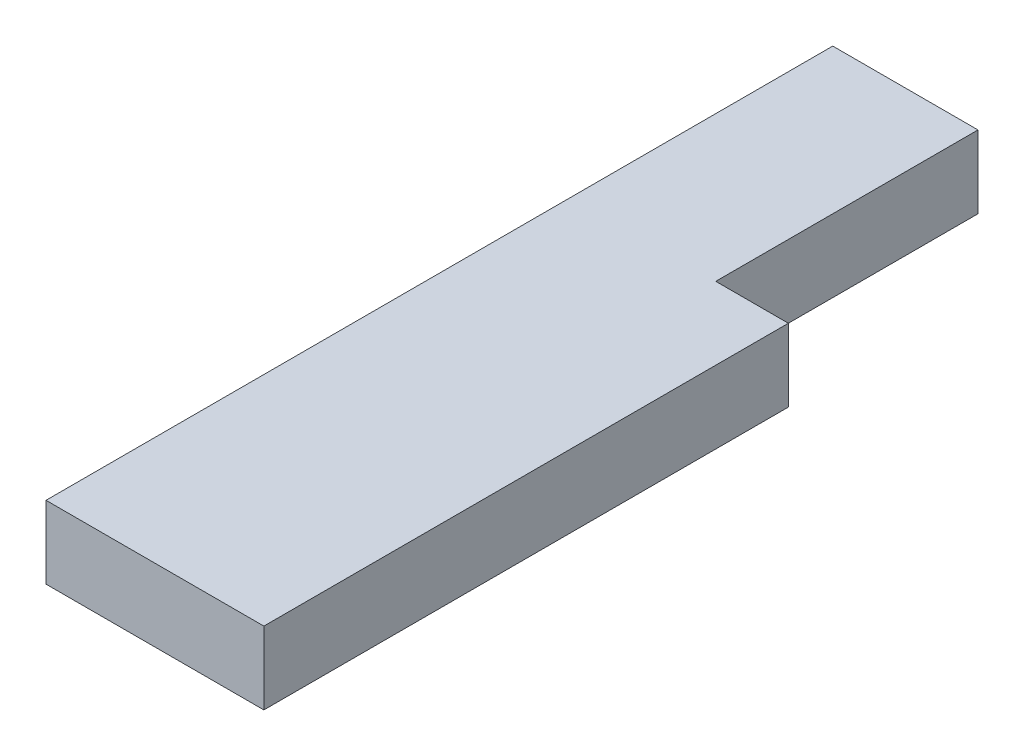
ISO-10303-21;
HEADER;
FILE_DESCRIPTION(('STEP AP214'),'2;1');
FILE_NAME('part.step','',(''),(''),'','','');
FILE_SCHEMA(('AUTOMOTIVE_DESIGN { 1 0 10303 214 1 1 1 1 }'));
ENDSEC;
DATA;
#1=APPLICATION_CONTEXT('core data for automotive mechanical design processes');
#2=APPLICATION_PROTOCOL_DEFINITION('international standard','automotive_design',2000,#1);
#3=PRODUCT_CONTEXT('',#1,'mechanical');
#4=PRODUCT('Part','Part','',(#3));
#5=PRODUCT_RELATED_PRODUCT_CATEGORY('part','',(#4));
#6=PRODUCT_DEFINITION_FORMATION('','',#4);
#7=PRODUCT_DEFINITION_CONTEXT('part definition',#1,'design');
#8=PRODUCT_DEFINITION('design','',#6,#7);
#9=PRODUCT_DEFINITION_SHAPE('','',#8);
#10=(LENGTH_UNIT() NAMED_UNIT(*) SI_UNIT(.MILLI.,.METRE.));
#11=(NAMED_UNIT(*) PLANE_ANGLE_UNIT() SI_UNIT($,.RADIAN.));
#12=(NAMED_UNIT(*) SI_UNIT($,.STERADIAN.) SOLID_ANGLE_UNIT());
#13=UNCERTAINTY_MEASURE_WITH_UNIT(LENGTH_MEASURE(1.E-05),#10,'distance_accuracy_value','');
#14=(GEOMETRIC_REPRESENTATION_CONTEXT(3) GLOBAL_UNCERTAINTY_ASSIGNED_CONTEXT((#13)) GLOBAL_UNIT_ASSIGNED_CONTEXT((#10,
#11,#12)) REPRESENTATION_CONTEXT('',''));
#15=CARTESIAN_POINT('',(0.,0.,0.));
#16=DIRECTION('',(0.,0.,1.));
#17=DIRECTION('',(1.,0.,0.));
#18=AXIS2_PLACEMENT_3D('',#15,#16,#17);
#19=CARTESIAN_POINT('',(-27.,-9.,130.));
#20=DIRECTION('',(-1.,0.,0.));
#21=DIRECTION('',(0.,0.,1.));
#22=AXIS2_PLACEMENT_3D('',#19,#20,#21);
#23=PLANE('',#22);
#24=DIRECTION('',(0.,0.,-1.));
#25=VECTOR('',#24,1.);
#26=CARTESIAN_POINT('',(-27.,9.,130.));
#27=LINE('',#26,#25);
#28=CARTESIAN_POINT('',(-27.,9.,130.));
#29=VERTEX_POINT('',#28);
#30=CARTESIAN_POINT('',(-27.,9.,-65.));
#31=VERTEX_POINT('',#30);
#32=EDGE_CURVE('E40',#29,#31,#27,.T.);
#33=ORIENTED_EDGE('',*,*,#32,.T.);
#34=DIRECTION('',(0.,1.,0.));
#35=VECTOR('',#34,1.);
#36=CARTESIAN_POINT('',(-27.,-9.,-65.));
#37=LINE('',#36,#35);
#38=CARTESIAN_POINT('',(-27.,-9.,-65.));
#39=VERTEX_POINT('',#38);
#40=EDGE_CURVE('E103',#39,#31,#37,.T.);
#41=ORIENTED_EDGE('',*,*,#40,.F.);
#42=DIRECTION('',(0.,0.,-1.));
#43=VECTOR('',#42,1.);
#44=CARTESIAN_POINT('',(-27.,-9.,130.));
#45=LINE('',#44,#43);
#46=CARTESIAN_POINT('',(-27.,-9.,130.));
#47=VERTEX_POINT('',#46);
#48=EDGE_CURVE('E11',#47,#39,#45,.T.);
#49=ORIENTED_EDGE('',*,*,#48,.F.);
#50=DIRECTION('',(0.,1.,0.));
#51=VECTOR('',#50,1.);
#52=CARTESIAN_POINT('',(-27.,-9.,130.));
#53=LINE('',#52,#51);
#54=EDGE_CURVE('E122',#47,#29,#53,.T.);
#55=ORIENTED_EDGE('',*,*,#54,.T.);
#56=EDGE_LOOP('',(#33,#41,#49,#55));
#57=FACE_BOUND('',#56,.T.);
#58=ADVANCED_FACE('F37',(#57),#23,.T.);
#59=CARTESIAN_POINT('',(-27.,-9.,130.));
#60=DIRECTION('',(0.,1.,0.));
#61=DIRECTION('',(0.,0.,1.));
#62=AXIS2_PLACEMENT_3D('',#59,#60,#61);
#63=PLANE('',#62);
#64=ORIENTED_EDGE('',*,*,#48,.T.);
#65=DIRECTION('',(-1.,0.,0.));
#66=VECTOR('',#65,1.);
#67=CARTESIAN_POINT('',(9.00000000000001,-9.,-65.));
#68=LINE('',#67,#66);
#69=CARTESIAN_POINT('',(9.00000000000001,-9.,-65.));
#70=VERTEX_POINT('',#69);
#71=EDGE_CURVE('E99',#70,#39,#68,.T.);
#72=ORIENTED_EDGE('',*,*,#71,.F.);
#73=DIRECTION('',(0.,0.,1.));
#74=VECTOR('',#73,1.);
#75=CARTESIAN_POINT('',(9.00000000000001,-9.,-65.));
#76=LINE('',#75,#74);
#77=CARTESIAN_POINT('',(9.00000000000001,-9.,0.));
#78=VERTEX_POINT('',#77);
#79=EDGE_CURVE('E115',#70,#78,#76,.T.);
#80=ORIENTED_EDGE('',*,*,#79,.T.);
#81=DIRECTION('',(1.,0.,0.));
#82=VECTOR('',#81,1.);
#83=CARTESIAN_POINT('',(-27.,-9.,0.));
#84=LINE('',#83,#82);
#85=CARTESIAN_POINT('',(27.,-9.,0.));
#86=VERTEX_POINT('',#85);
#87=EDGE_CURVE('E75',#78,#86,#84,.T.);
#88=ORIENTED_EDGE('',*,*,#87,.T.);
#89=DIRECTION('',(0.,0.,-1.));
#90=VECTOR('',#89,1.);
#91=CARTESIAN_POINT('',(27.,-9.,130.));
#92=LINE('',#91,#90);
#93=CARTESIAN_POINT('',(27.,-9.,130.));
#94=VERTEX_POINT('',#93);
#95=EDGE_CURVE('E45',#94,#86,#92,.T.);
#96=ORIENTED_EDGE('',*,*,#95,.F.);
#97=DIRECTION('',(1.,0.,0.));
#98=VECTOR('',#97,1.);
#99=CARTESIAN_POINT('',(-27.,-9.,130.));
#100=LINE('',#99,#98);
#101=EDGE_CURVE('E100',#47,#94,#100,.T.);
#102=ORIENTED_EDGE('',*,*,#101,.F.);
#103=EDGE_LOOP('',(#64,#72,#80,#88,#96,#102));
#104=FACE_BOUND('',#103,.T.);
#105=ADVANCED_FACE('F97',(#104),#63,.F.);
#106=CARTESIAN_POINT('',(27.,-9.,130.));
#107=DIRECTION('',(-1.,0.,0.));
#108=DIRECTION('',(0.,0.,1.));
#109=AXIS2_PLACEMENT_3D('',#106,#107,#108);
#110=PLANE('',#109);
#111=DIRECTION('',(0.,1.,0.));
#112=VECTOR('',#111,1.);
#113=CARTESIAN_POINT('',(27.,-9.,0.));
#114=LINE('',#113,#112);
#115=CARTESIAN_POINT('',(27.,9.,0.));
#116=VERTEX_POINT('',#115);
#117=EDGE_CURVE('E130',#86,#116,#114,.T.);
#118=ORIENTED_EDGE('',*,*,#117,.T.);
#119=DIRECTION('',(0.,0.,-1.));
#120=VECTOR('',#119,1.);
#121=CARTESIAN_POINT('',(27.,9.,130.));
#122=LINE('',#121,#120);
#123=CARTESIAN_POINT('',(27.,9.,130.));
#124=VERTEX_POINT('',#123);
#125=EDGE_CURVE('E134',#124,#116,#122,.T.);
#126=ORIENTED_EDGE('',*,*,#125,.F.);
#127=DIRECTION('',(0.,1.,0.));
#128=VECTOR('',#127,1.);
#129=CARTESIAN_POINT('',(27.,-9.,130.));
#130=LINE('',#129,#128);
#131=EDGE_CURVE('E126',#94,#124,#130,.T.);
#132=ORIENTED_EDGE('',*,*,#131,.F.);
#133=ORIENTED_EDGE('',*,*,#95,.T.);
#134=EDGE_LOOP('',(#118,#126,#132,#133));
#135=FACE_BOUND('',#134,.T.);
#136=ADVANCED_FACE('F142',(#135),#110,.F.);
#137=CARTESIAN_POINT('',(-27.,9.,130.));
#138=DIRECTION('',(0.,1.,0.));
#139=DIRECTION('',(0.,0.,1.));
#140=AXIS2_PLACEMENT_3D('',#137,#138,#139);
#141=PLANE('',#140);
#142=DIRECTION('',(1.,0.,0.));
#143=VECTOR('',#142,1.);
#144=CARTESIAN_POINT('',(-27.,9.,0.));
#145=LINE('',#144,#143);
#146=CARTESIAN_POINT('',(9.00000000000001,9.,0.));
#147=VERTEX_POINT('',#146);
#148=EDGE_CURVE('E121',#147,#116,#145,.T.);
#149=ORIENTED_EDGE('',*,*,#148,.F.);
#150=DIRECTION('',(0.,0.,1.));
#151=VECTOR('',#150,1.);
#152=CARTESIAN_POINT('',(9.00000000000001,8.99999999999999,-65.));
#153=LINE('',#152,#151);
#154=CARTESIAN_POINT('',(9.00000000000001,8.99999999999999,-65.));
#155=VERTEX_POINT('',#154);
#156=EDGE_CURVE('E118',#155,#147,#153,.T.);
#157=ORIENTED_EDGE('',*,*,#156,.F.);
#158=DIRECTION('',(1.,0.,0.));
#159=VECTOR('',#158,1.);
#160=CARTESIAN_POINT('',(-27.,9.,-65.));
#161=LINE('',#160,#159);
#162=EDGE_CURVE('E105',#31,#155,#161,.T.);
#163=ORIENTED_EDGE('',*,*,#162,.F.);
#164=ORIENTED_EDGE('',*,*,#32,.F.);
#165=DIRECTION('',(1.,0.,0.));
#166=VECTOR('',#165,1.);
#167=CARTESIAN_POINT('',(-27.,9.,130.));
#168=LINE('',#167,#166);
#169=EDGE_CURVE('E124',#29,#124,#168,.T.);
#170=ORIENTED_EDGE('',*,*,#169,.T.);
#171=ORIENTED_EDGE('',*,*,#125,.T.);
#172=EDGE_LOOP('',(#149,#157,#163,#164,#170,#171));
#173=FACE_BOUND('',#172,.T.);
#174=ADVANCED_FACE('F137',(#173),#141,.T.);
#175=CARTESIAN_POINT('',(0.,0.,130.));
#176=DIRECTION('',(0.,0.,-1.));
#177=DIRECTION('',(-1.,0.,0.));
#178=AXIS2_PLACEMENT_3D('',#175,#176,#177);
#179=PLANE('',#178);
#180=ORIENTED_EDGE('',*,*,#54,.F.);
#181=ORIENTED_EDGE('',*,*,#101,.T.);
#182=ORIENTED_EDGE('',*,*,#131,.T.);
#183=ORIENTED_EDGE('',*,*,#169,.F.);
#184=EDGE_LOOP('',(#180,#181,#182,#183));
#185=FACE_BOUND('',#184,.T.);
#186=ADVANCED_FACE('F154',(#185),#179,.F.);
#187=CARTESIAN_POINT('',(0.,0.,0.));
#188=DIRECTION('',(0.,0.,-1.));
#189=DIRECTION('',(-1.,0.,0.));
#190=AXIS2_PLACEMENT_3D('',#187,#188,#189);
#191=PLANE('',#190);
#192=DIRECTION('',(0.,-1.,0.));
#193=VECTOR('',#192,1.);
#194=CARTESIAN_POINT('',(9.00000000000001,8.99999999999999,0.));
#195=LINE('',#194,#193);
#196=EDGE_CURVE('E53',#147,#78,#195,.T.);
#197=ORIENTED_EDGE('',*,*,#196,.F.);
#198=ORIENTED_EDGE('',*,*,#148,.T.);
#199=ORIENTED_EDGE('',*,*,#117,.F.);
#200=ORIENTED_EDGE('',*,*,#87,.F.);
#201=EDGE_LOOP('',(#197,#198,#199,#200));
#202=FACE_BOUND('',#201,.T.);
#203=ADVANCED_FACE('F143',(#202),#191,.T.);
#204=CARTESIAN_POINT('',(9.00000000000001,8.99999999999999,-65.));
#205=DIRECTION('',(-1.,0.,0.));
#206=DIRECTION('',(0.,0.,1.));
#207=AXIS2_PLACEMENT_3D('',#204,#205,#206);
#208=PLANE('',#207);
#209=ORIENTED_EDGE('',*,*,#196,.T.);
#210=ORIENTED_EDGE('',*,*,#79,.F.);
#211=DIRECTION('',(0.,-1.,0.));
#212=VECTOR('',#211,1.);
#213=CARTESIAN_POINT('',(9.00000000000001,8.99999999999999,-65.));
#214=LINE('',#213,#212);
#215=EDGE_CURVE('E109',#155,#70,#214,.T.);
#216=ORIENTED_EDGE('',*,*,#215,.F.);
#217=ORIENTED_EDGE('',*,*,#156,.T.);
#218=EDGE_LOOP('',(#209,#210,#216,#217));
#219=FACE_BOUND('',#218,.T.);
#220=ADVANCED_FACE('F145',(#219),#208,.F.);
#221=CARTESIAN_POINT('',(0.,0.,-65.));
#222=DIRECTION('',(0.,0.,-1.));
#223=DIRECTION('',(-1.,0.,0.));
#224=AXIS2_PLACEMENT_3D('',#221,#222,#223);
#225=PLANE('',#224);
#226=ORIENTED_EDGE('',*,*,#71,.T.);
#227=ORIENTED_EDGE('',*,*,#40,.T.);
#228=ORIENTED_EDGE('',*,*,#162,.T.);
#229=ORIENTED_EDGE('',*,*,#215,.T.);
#230=EDGE_LOOP('',(#226,#227,#228,#229));
#231=FACE_BOUND('',#230,.T.);
#232=ADVANCED_FACE('F107',(#231),#225,.T.);
#233=CLOSED_SHELL('',(#58,#105,#136,#174,#186,#203,#220,#232));
#234=MANIFOLD_SOLID_BREP('B2',#233);
#235=ADVANCED_BREP_SHAPE_REPRESENTATION('',(#18,#234),#14);
#236=SHAPE_DEFINITION_REPRESENTATION(#9,#235);
ENDSEC;
END-ISO-10303-21;
